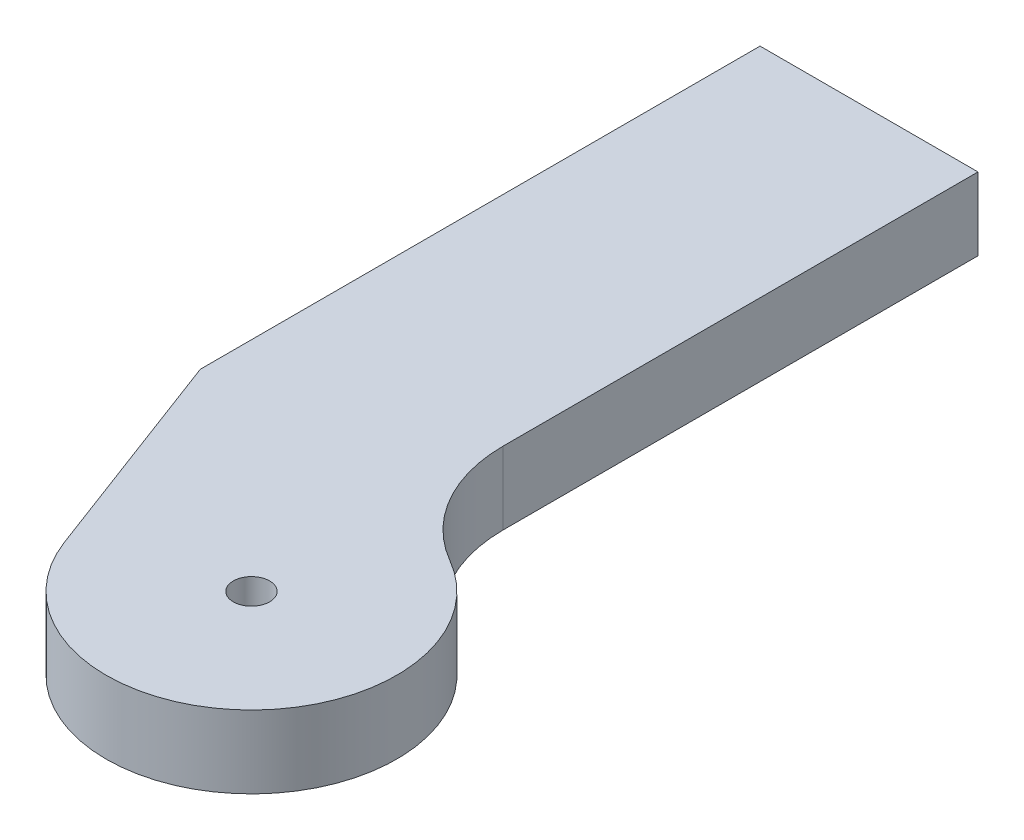
ISO-10303-21;
HEADER;
FILE_DESCRIPTION(('STEP AP214'),'2;1');
FILE_NAME('part.step','',(''),(''),'','','');
FILE_SCHEMA(('AUTOMOTIVE_DESIGN { 1 0 10303 214 1 1 1 1 }'));
ENDSEC;
DATA;
#1=APPLICATION_CONTEXT('core data for automotive mechanical design processes');
#2=APPLICATION_PROTOCOL_DEFINITION('international standard','automotive_design',2000,#1);
#3=PRODUCT_CONTEXT('',#1,'mechanical');
#4=PRODUCT('Part','Part','',(#3));
#5=PRODUCT_RELATED_PRODUCT_CATEGORY('part','',(#4));
#6=PRODUCT_DEFINITION_FORMATION('','',#4);
#7=PRODUCT_DEFINITION_CONTEXT('part definition',#1,'design');
#8=PRODUCT_DEFINITION('design','',#6,#7);
#9=PRODUCT_DEFINITION_SHAPE('','',#8);
#10=(LENGTH_UNIT() NAMED_UNIT(*) SI_UNIT(.MILLI.,.METRE.));
#11=(NAMED_UNIT(*) PLANE_ANGLE_UNIT() SI_UNIT($,.RADIAN.));
#12=(NAMED_UNIT(*) SI_UNIT($,.STERADIAN.) SOLID_ANGLE_UNIT());
#13=UNCERTAINTY_MEASURE_WITH_UNIT(LENGTH_MEASURE(1.E-05),#10,'distance_accuracy_value','');
#14=(GEOMETRIC_REPRESENTATION_CONTEXT(3) GLOBAL_UNCERTAINTY_ASSIGNED_CONTEXT((#13)) GLOBAL_UNIT_ASSIGNED_CONTEXT((#10,
#11,#12)) REPRESENTATION_CONTEXT('',''));
#15=CARTESIAN_POINT('',(0.,0.,0.));
#16=DIRECTION('',(0.,0.,1.));
#17=DIRECTION('',(1.,0.,0.));
#18=AXIS2_PLACEMENT_3D('',#15,#16,#17);
#19=CARTESIAN_POINT('',(-9.36026540845976,5.,3.51929417400587));
#20=DIRECTION('',(-0.936026540845976,0.,0.351929417400587));
#21=DIRECTION('',(0.351929417400587,0.,0.936026540845976));
#22=AXIS2_PLACEMENT_3D('',#19,#20,#21);
#23=PLANE('',#22);
#24=DIRECTION('',(-0.351929417400587,0.,-0.936026540845976));
#25=VECTOR('',#24,1.);
#26=CARTESIAN_POINT('',(-9.36026540845976,0.,3.51929417400587));
#27=LINE('',#26,#25);
#28=CARTESIAN_POINT('',(-9.36026540845976,0.,3.51929417400587));
#29=VERTEX_POINT('',#28);
#30=CARTESIAN_POINT('',(-15.,0.,-11.4807058259941));
#31=VERTEX_POINT('',#30);
#32=EDGE_CURVE('E93',#29,#31,#27,.T.);
#33=ORIENTED_EDGE('',*,*,#32,.F.);
#34=DIRECTION('',(0.,-1.,0.));
#35=VECTOR('',#34,1.);
#36=CARTESIAN_POINT('',(-9.36026540845976,5.,3.51929417400587));
#37=LINE('',#36,#35);
#38=CARTESIAN_POINT('',(-9.36026540845976,5.,3.51929417400587));
#39=VERTEX_POINT('',#38);
#40=EDGE_CURVE('E88',#39,#29,#37,.T.);
#41=ORIENTED_EDGE('',*,*,#40,.F.);
#42=DIRECTION('',(-0.351929417400587,0.,-0.936026540845976));
#43=VECTOR('',#42,1.);
#44=CARTESIAN_POINT('',(-9.36026540845976,5.,3.51929417400587));
#45=LINE('',#44,#43);
#46=CARTESIAN_POINT('',(-15.,5.,-11.4807058259941));
#47=VERTEX_POINT('',#46);
#48=EDGE_CURVE('E90',#39,#47,#45,.T.);
#49=ORIENTED_EDGE('',*,*,#48,.T.);
#50=DIRECTION('',(0.,-1.,0.));
#51=VECTOR('',#50,1.);
#52=CARTESIAN_POINT('',(-15.,5.,-11.4807058259941));
#53=LINE('',#52,#51);
#54=EDGE_CURVE('E121',#47,#31,#53,.T.);
#55=ORIENTED_EDGE('',*,*,#54,.T.);
#56=EDGE_LOOP('',(#33,#41,#49,#55));
#57=FACE_BOUND('',#56,.T.);
#58=ADVANCED_FACE('F35',(#57),#23,.T.);
#59=CARTESIAN_POINT('',(0.,5.,0.));
#60=DIRECTION('',(0.,-1.,0.));
#61=DIRECTION('',(0.,0.,-1.));
#62=AXIS2_PLACEMENT_3D('',#59,#60,#61);
#63=CYLINDRICAL_SURFACE('',#62,10.);
#64=CARTESIAN_POINT('',(0.,0.,0.));
#65=DIRECTION('',(0.,1.,0.));
#66=DIRECTION('',(0.,0.,1.));
#67=AXIS2_PLACEMENT_3D('',#64,#65,#66);
#68=CIRCLE('',#67,10.);
#69=CARTESIAN_POINT('',(5.,0.,-8.66025403784439));
#70=VERTEX_POINT('',#69);
#71=EDGE_CURVE('E123',#29,#70,#68,.T.);
#72=ORIENTED_EDGE('',*,*,#71,.T.);
#73=DIRECTION('',(0.,-1.,0.));
#74=VECTOR('',#73,1.);
#75=CARTESIAN_POINT('',(5.,5.,-8.66025403784439));
#76=LINE('',#75,#74);
#77=CARTESIAN_POINT('',(5.,5.,-8.66025403784439));
#78=VERTEX_POINT('',#77);
#79=EDGE_CURVE('E50',#70,#78,#76,.F.);
#80=ORIENTED_EDGE('',*,*,#79,.T.);
#81=CARTESIAN_POINT('',(0.,5.,0.));
#82=DIRECTION('',(0.,1.,0.));
#83=DIRECTION('',(0.,0.,1.));
#84=AXIS2_PLACEMENT_3D('',#81,#82,#83);
#85=CIRCLE('',#84,10.);
#86=EDGE_CURVE('E97',#39,#78,#85,.T.);
#87=ORIENTED_EDGE('',*,*,#86,.F.);
#88=ORIENTED_EDGE('',*,*,#40,.T.);
#89=EDGE_LOOP('',(#72,#80,#87,#88));
#90=FACE_BOUND('',#89,.T.);
#91=ADVANCED_FACE('F98',(#90),#63,.T.);
#92=CARTESIAN_POINT('',(0.,5.,0.));
#93=DIRECTION('',(-1.,0.,0.));
#94=DIRECTION('',(0.,0.,1.));
#95=AXIS2_PLACEMENT_3D('',#92,#93,#94);
#96=PLANE('',#95);
#97=DIRECTION('',(0.,0.,-1.));
#98=VECTOR('',#97,1.);
#99=CARTESIAN_POINT('',(0.,5.,0.));
#100=LINE('',#99,#98);
#101=CARTESIAN_POINT('',(0.,5.,-17.3205080756888));
#102=VERTEX_POINT('',#101);
#103=CARTESIAN_POINT('',(0.,5.,-50.));
#104=VERTEX_POINT('',#103);
#105=EDGE_CURVE('E101',#102,#104,#100,.T.);
#106=ORIENTED_EDGE('',*,*,#105,.F.);
#107=DIRECTION('',(0.,1.,0.));
#108=VECTOR('',#107,1.);
#109=CARTESIAN_POINT('',(0.,0.,-17.3205080756888));
#110=LINE('',#109,#108);
#111=CARTESIAN_POINT('',(0.,0.,-17.3205080756888));
#112=VERTEX_POINT('',#111);
#113=EDGE_CURVE('E94',#102,#112,#110,.F.);
#114=ORIENTED_EDGE('',*,*,#113,.T.);
#115=DIRECTION('',(0.,0.,-1.));
#116=VECTOR('',#115,1.);
#117=CARTESIAN_POINT('',(0.,0.,0.));
#118=LINE('',#117,#116);
#119=CARTESIAN_POINT('',(0.,0.,-50.));
#120=VERTEX_POINT('',#119);
#121=EDGE_CURVE('E126',#112,#120,#118,.T.);
#122=ORIENTED_EDGE('',*,*,#121,.T.);
#123=DIRECTION('',(0.,-1.,0.));
#124=VECTOR('',#123,1.);
#125=CARTESIAN_POINT('',(0.,5.,-50.));
#126=LINE('',#125,#124);
#127=EDGE_CURVE('E95',#104,#120,#126,.T.);
#128=ORIENTED_EDGE('',*,*,#127,.F.);
#129=EDGE_LOOP('',(#106,#114,#122,#128));
#130=FACE_BOUND('',#129,.T.);
#131=ADVANCED_FACE('F140',(#130),#96,.F.);
#132=CARTESIAN_POINT('',(0.,5.,-50.));
#133=DIRECTION('',(0.,0.,-1.));
#134=DIRECTION('',(-1.,0.,0.));
#135=AXIS2_PLACEMENT_3D('',#132,#133,#134);
#136=PLANE('',#135);
#137=DIRECTION('',(1.,0.,0.));
#138=VECTOR('',#137,1.);
#139=CARTESIAN_POINT('',(0.,0.,-50.));
#140=LINE('',#139,#138);
#141=CARTESIAN_POINT('',(-15.,0.,-50.));
#142=VERTEX_POINT('',#141);
#143=EDGE_CURVE('E110',#142,#120,#140,.T.);
#144=ORIENTED_EDGE('',*,*,#143,.F.);
#145=DIRECTION('',(0.,-1.,0.));
#146=VECTOR('',#145,1.);
#147=CARTESIAN_POINT('',(-15.,5.,-50.));
#148=LINE('',#147,#146);
#149=CARTESIAN_POINT('',(-15.,5.,-50.));
#150=VERTEX_POINT('',#149);
#151=EDGE_CURVE('E131',#150,#142,#148,.T.);
#152=ORIENTED_EDGE('',*,*,#151,.F.);
#153=DIRECTION('',(1.,0.,0.));
#154=VECTOR('',#153,1.);
#155=CARTESIAN_POINT('',(0.,5.,-50.));
#156=LINE('',#155,#154);
#157=EDGE_CURVE('E117',#150,#104,#156,.T.);
#158=ORIENTED_EDGE('',*,*,#157,.T.);
#159=ORIENTED_EDGE('',*,*,#127,.T.);
#160=EDGE_LOOP('',(#144,#152,#158,#159));
#161=FACE_BOUND('',#160,.T.);
#162=ADVANCED_FACE('F147',(#161),#136,.T.);
#163=CARTESIAN_POINT('',(-15.,5.,0.));
#164=DIRECTION('',(-1.,0.,0.));
#165=DIRECTION('',(0.,0.,1.));
#166=AXIS2_PLACEMENT_3D('',#163,#164,#165);
#167=PLANE('',#166);
#168=DIRECTION('',(0.,0.,-1.));
#169=VECTOR('',#168,1.);
#170=CARTESIAN_POINT('',(-15.,0.,0.));
#171=LINE('',#170,#169);
#172=EDGE_CURVE('E107',#31,#142,#171,.T.);
#173=ORIENTED_EDGE('',*,*,#172,.F.);
#174=ORIENTED_EDGE('',*,*,#54,.F.);
#175=DIRECTION('',(0.,0.,-1.));
#176=VECTOR('',#175,1.);
#177=CARTESIAN_POINT('',(-15.,5.,0.));
#178=LINE('',#177,#176);
#179=EDGE_CURVE('E106',#47,#150,#178,.T.);
#180=ORIENTED_EDGE('',*,*,#179,.T.);
#181=ORIENTED_EDGE('',*,*,#151,.T.);
#182=EDGE_LOOP('',(#173,#174,#180,#181));
#183=FACE_BOUND('',#182,.T.);
#184=ADVANCED_FACE('F149',(#183),#167,.T.);
#185=CARTESIAN_POINT('',(0.,5.,0.));
#186=DIRECTION('',(0.,1.,0.));
#187=DIRECTION('',(0.,0.,1.));
#188=AXIS2_PLACEMENT_3D('',#185,#186,#187);
#189=PLANE('',#188);
#190=CARTESIAN_POINT('',(0.,5.,0.));
#191=DIRECTION('',(0.,1.,0.));
#192=DIRECTION('',(0.,0.,1.));
#193=AXIS2_PLACEMENT_3D('',#190,#191,#192);
#194=CIRCLE('',#193,1.25);
#195=CARTESIAN_POINT('',(0.,5.,1.25));
#196=VERTEX_POINT('',#195);
#197=EDGE_CURVE('E113',#196,#196,#194,.T.);
#198=ORIENTED_EDGE('',*,*,#197,.F.);
#199=EDGE_LOOP('',(#198));
#200=FACE_BOUND('',#199,.T.);
#201=ORIENTED_EDGE('',*,*,#48,.F.);
#202=ORIENTED_EDGE('',*,*,#86,.T.);
#203=CARTESIAN_POINT('',(10.,5.,-17.3205080756888));
#204=DIRECTION('',(0.,1.,0.));
#205=DIRECTION('',(0.,0.,1.));
#206=AXIS2_PLACEMENT_3D('',#203,#204,#205);
#207=CIRCLE('',#206,10.);
#208=EDGE_CURVE('E11',#78,#102,#207,.F.);
#209=ORIENTED_EDGE('',*,*,#208,.T.);
#210=ORIENTED_EDGE('',*,*,#105,.T.);
#211=ORIENTED_EDGE('',*,*,#157,.F.);
#212=ORIENTED_EDGE('',*,*,#179,.F.);
#213=EDGE_LOOP('',(#201,#202,#209,#210,#211,#212));
#214=FACE_BOUND('',#213,.T.);
#215=ADVANCED_FACE('F103',(#200,#214),#189,.T.);
#216=CARTESIAN_POINT('',(0.,0.,0.));
#217=DIRECTION('',(0.,1.,0.));
#218=DIRECTION('',(0.,0.,1.));
#219=AXIS2_PLACEMENT_3D('',#216,#217,#218);
#220=PLANE('',#219);
#221=CARTESIAN_POINT('',(0.,0.,0.));
#222=DIRECTION('',(0.,1.,0.));
#223=DIRECTION('',(0.,0.,1.));
#224=AXIS2_PLACEMENT_3D('',#221,#222,#223);
#225=CIRCLE('',#224,1.25);
#226=CARTESIAN_POINT('',(0.,0.,1.25));
#227=VERTEX_POINT('',#226);
#228=EDGE_CURVE('E124',#227,#227,#225,.T.);
#229=ORIENTED_EDGE('',*,*,#228,.T.);
#230=EDGE_LOOP('',(#229));
#231=FACE_BOUND('',#230,.T.);
#232=ORIENTED_EDGE('',*,*,#32,.T.);
#233=ORIENTED_EDGE('',*,*,#172,.T.);
#234=ORIENTED_EDGE('',*,*,#143,.T.);
#235=ORIENTED_EDGE('',*,*,#121,.F.);
#236=CARTESIAN_POINT('',(10.,0.,-17.3205080756888));
#237=DIRECTION('',(0.,1.,0.));
#238=DIRECTION('',(0.,0.,1.));
#239=AXIS2_PLACEMENT_3D('',#236,#237,#238);
#240=CIRCLE('',#239,10.);
#241=EDGE_CURVE('E43',#112,#70,#240,.T.);
#242=ORIENTED_EDGE('',*,*,#241,.T.);
#243=ORIENTED_EDGE('',*,*,#71,.F.);
#244=EDGE_LOOP('',(#232,#233,#234,#235,#242,#243));
#245=FACE_BOUND('',#244,.T.);
#246=ADVANCED_FACE('F143',(#231,#245),#220,.F.);
#247=CARTESIAN_POINT('',(10.,5.,-17.3205080756888));
#248=DIRECTION('',(0.,-1.,0.));
#249=DIRECTION('',(0.,0.,-1.));
#250=AXIS2_PLACEMENT_3D('',#247,#248,#249);
#251=CYLINDRICAL_SURFACE('',#250,10.);
#252=ORIENTED_EDGE('',*,*,#208,.F.);
#253=ORIENTED_EDGE('',*,*,#79,.F.);
#254=ORIENTED_EDGE('',*,*,#241,.F.);
#255=ORIENTED_EDGE('',*,*,#113,.F.);
#256=EDGE_LOOP('',(#252,#253,#254,#255));
#257=FACE_BOUND('',#256,.T.);
#258=ADVANCED_FACE('F37',(#257),#251,.F.);
#259=CARTESIAN_POINT('',(0.,0.,0.));
#260=DIRECTION('',(0.,1.,0.));
#261=DIRECTION('',(0.,0.,1.));
#262=AXIS2_PLACEMENT_3D('',#259,#260,#261);
#263=CYLINDRICAL_SURFACE('',#262,1.25);
#264=ORIENTED_EDGE('',*,*,#228,.F.);
#265=EDGE_LOOP('',(#264));
#266=FACE_BOUND('',#265,.T.);
#267=ORIENTED_EDGE('',*,*,#197,.T.);
#268=EDGE_LOOP('',(#267));
#269=FACE_BOUND('',#268,.T.);
#270=ADVANCED_FACE('F151',(#266,#269),#263,.F.);
#271=CLOSED_SHELL('',(#58,#91,#131,#162,#184,#215,#246,#258,#270));
#272=MANIFOLD_SOLID_BREP('B2',#271);
#273=ADVANCED_BREP_SHAPE_REPRESENTATION('',(#18,#272),#14);
#274=SHAPE_DEFINITION_REPRESENTATION(#9,#273);
ENDSEC;
END-ISO-10303-21;
